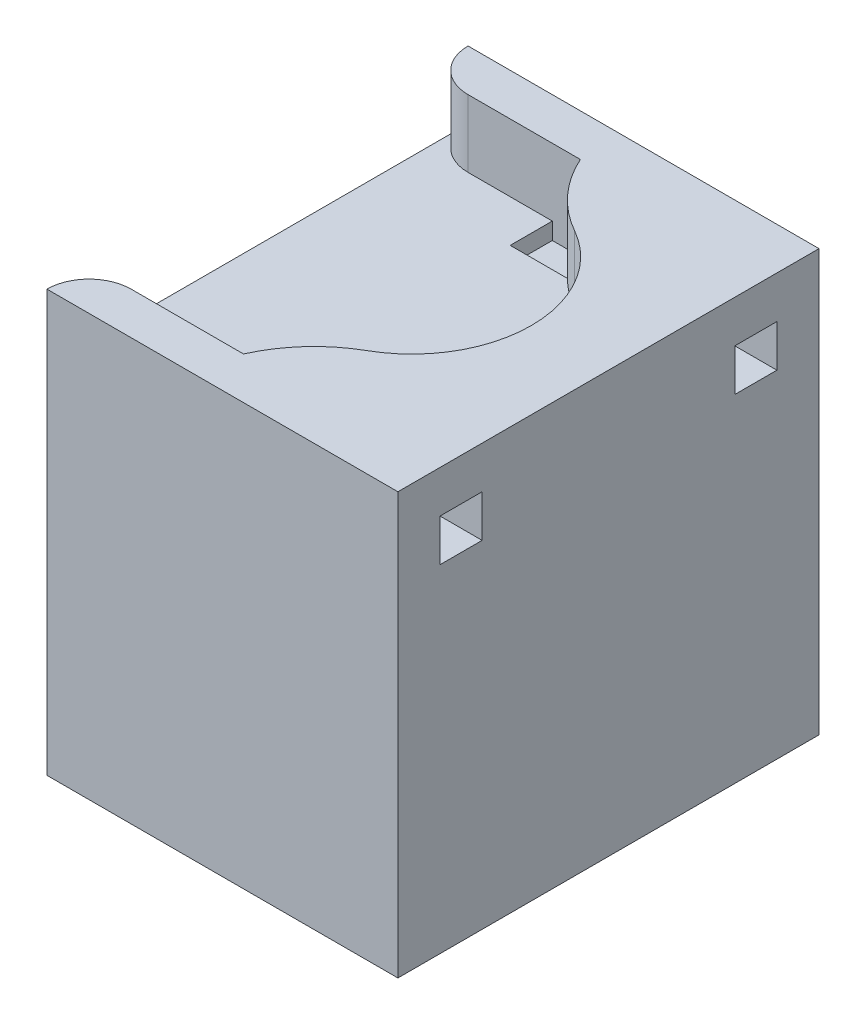
ISO-10303-21;
HEADER;
FILE_DESCRIPTION(('STEP AP214'),'2;1');
FILE_NAME('part.step','',(''),(''),'','','');
FILE_SCHEMA(('AUTOMOTIVE_DESIGN { 1 0 10303 214 1 1 1 1 }'));
ENDSEC;
DATA;
#1=APPLICATION_CONTEXT('core data for automotive mechanical design processes');
#2=APPLICATION_PROTOCOL_DEFINITION('international standard','automotive_design',2000,#1);
#3=PRODUCT_CONTEXT('',#1,'mechanical');
#4=PRODUCT('Part','Part','',(#3));
#5=PRODUCT_RELATED_PRODUCT_CATEGORY('part','',(#4));
#6=PRODUCT_DEFINITION_FORMATION('','',#4);
#7=PRODUCT_DEFINITION_CONTEXT('part definition',#1,'design');
#8=PRODUCT_DEFINITION('design','',#6,#7);
#9=PRODUCT_DEFINITION_SHAPE('','',#8);
#10=(LENGTH_UNIT() NAMED_UNIT(*) SI_UNIT(.MILLI.,.METRE.));
#11=(NAMED_UNIT(*) PLANE_ANGLE_UNIT() SI_UNIT($,.RADIAN.));
#12=(NAMED_UNIT(*) SI_UNIT($,.STERADIAN.) SOLID_ANGLE_UNIT());
#13=UNCERTAINTY_MEASURE_WITH_UNIT(LENGTH_MEASURE(1.E-05),#10,'distance_accuracy_value','');
#14=(GEOMETRIC_REPRESENTATION_CONTEXT(3) GLOBAL_UNCERTAINTY_ASSIGNED_CONTEXT((#13)) GLOBAL_UNIT_ASSIGNED_CONTEXT((#10,
#11,#12)) REPRESENTATION_CONTEXT('',''));
#15=CARTESIAN_POINT('',(0.,0.,0.));
#16=DIRECTION('',(0.,0.,1.));
#17=DIRECTION('',(1.,0.,0.));
#18=AXIS2_PLACEMENT_3D('',#15,#16,#17);
#19=CARTESIAN_POINT('',(12.5,30.,15.));
#20=DIRECTION('',(-1.,0.,0.));
#21=DIRECTION('',(0.,0.,1.));
#22=AXIS2_PLACEMENT_3D('',#19,#20,#21);
#23=PLANE('',#22);
#24=DIRECTION('',(0.,0.,-1.));
#25=VECTOR('',#24,1.);
#26=CARTESIAN_POINT('',(12.5,24.,-9.));
#27=LINE('',#26,#25);
#28=CARTESIAN_POINT('',(12.5,24.,-9.));
#29=VERTEX_POINT('',#28);
#30=CARTESIAN_POINT('',(12.5,24.,-12.));
#31=VERTEX_POINT('',#30);
#32=EDGE_CURVE('E235',#29,#31,#27,.T.);
#33=ORIENTED_EDGE('',*,*,#32,.F.);
#34=DIRECTION('',(0.,-1.,0.));
#35=VECTOR('',#34,1.);
#36=CARTESIAN_POINT('',(12.5,24.,-9.));
#37=LINE('',#36,#35);
#38=CARTESIAN_POINT('',(12.5,27.,-9.));
#39=VERTEX_POINT('',#38);
#40=EDGE_CURVE('E233',#39,#29,#37,.T.);
#41=ORIENTED_EDGE('',*,*,#40,.F.);
#42=DIRECTION('',(0.,0.,1.));
#43=VECTOR('',#42,1.);
#44=CARTESIAN_POINT('',(12.5,27.,-9.));
#45=LINE('',#44,#43);
#46=CARTESIAN_POINT('',(12.5,27.,-12.));
#47=VERTEX_POINT('',#46);
#48=EDGE_CURVE('E226',#47,#39,#45,.T.);
#49=ORIENTED_EDGE('',*,*,#48,.F.);
#50=DIRECTION('',(0.,1.,0.));
#51=VECTOR('',#50,1.);
#52=CARTESIAN_POINT('',(12.5,24.,-12.));
#53=LINE('',#52,#51);
#54=EDGE_CURVE('E239',#31,#47,#53,.T.);
#55=ORIENTED_EDGE('',*,*,#54,.F.);
#56=EDGE_LOOP('',(#33,#41,#49,#55));
#57=FACE_BOUND('',#56,.T.);
#58=DIRECTION('',(0.,1.,0.));
#59=VECTOR('',#58,1.);
#60=CARTESIAN_POINT('',(12.5,24.,9.));
#61=LINE('',#60,#59);
#62=CARTESIAN_POINT('',(12.5,24.,9.));
#63=VERTEX_POINT('',#62);
#64=CARTESIAN_POINT('',(12.5,27.,9.));
#65=VERTEX_POINT('',#64);
#66=EDGE_CURVE('E264',#63,#65,#61,.T.);
#67=ORIENTED_EDGE('',*,*,#66,.F.);
#68=DIRECTION('',(0.,0.,-1.));
#69=VECTOR('',#68,1.);
#70=CARTESIAN_POINT('',(12.5,24.,9.));
#71=LINE('',#70,#69);
#72=CARTESIAN_POINT('',(12.5,24.,12.));
#73=VERTEX_POINT('',#72);
#74=EDGE_CURVE('E222',#73,#63,#71,.T.);
#75=ORIENTED_EDGE('',*,*,#74,.F.);
#76=DIRECTION('',(0.,-1.,0.));
#77=VECTOR('',#76,1.);
#78=CARTESIAN_POINT('',(12.5,24.,12.));
#79=LINE('',#78,#77);
#80=CARTESIAN_POINT('',(12.5,27.,12.));
#81=VERTEX_POINT('',#80);
#82=EDGE_CURVE('E257',#81,#73,#79,.T.);
#83=ORIENTED_EDGE('',*,*,#82,.F.);
#84=DIRECTION('',(0.,0.,1.));
#85=VECTOR('',#84,1.);
#86=CARTESIAN_POINT('',(12.5,27.,9.));
#87=LINE('',#86,#85);
#88=EDGE_CURVE('E267',#65,#81,#87,.T.);
#89=ORIENTED_EDGE('',*,*,#88,.F.);
#90=EDGE_LOOP('',(#67,#75,#83,#89));
#91=FACE_BOUND('',#90,.T.);
#92=DIRECTION('',(0.,0.,-1.));
#93=VECTOR('',#92,1.);
#94=CARTESIAN_POINT('',(12.5,0.,15.));
#95=LINE('',#94,#93);
#96=CARTESIAN_POINT('',(12.5,0.,15.));
#97=VERTEX_POINT('',#96);
#98=CARTESIAN_POINT('',(12.5,0.,-15.));
#99=VERTEX_POINT('',#98);
#100=EDGE_CURVE('E246',#97,#99,#95,.T.);
#101=ORIENTED_EDGE('',*,*,#100,.T.);
#102=DIRECTION('',(0.,-1.,0.));
#103=VECTOR('',#102,1.);
#104=CARTESIAN_POINT('',(12.5,30.,-15.));
#105=LINE('',#104,#103);
#106=CARTESIAN_POINT('',(12.5,30.,-15.));
#107=VERTEX_POINT('',#106);
#108=EDGE_CURVE('E308',#107,#99,#105,.T.);
#109=ORIENTED_EDGE('',*,*,#108,.F.);
#110=DIRECTION('',(0.,0.,-1.));
#111=VECTOR('',#110,1.);
#112=CARTESIAN_POINT('',(12.5,30.,15.));
#113=LINE('',#112,#111);
#114=CARTESIAN_POINT('',(12.5,30.,15.));
#115=VERTEX_POINT('',#114);
#116=EDGE_CURVE('E279',#115,#107,#113,.T.);
#117=ORIENTED_EDGE('',*,*,#116,.F.);
#118=DIRECTION('',(0.,-1.,0.));
#119=VECTOR('',#118,1.);
#120=CARTESIAN_POINT('',(12.5,30.,15.));
#121=LINE('',#120,#119);
#122=EDGE_CURVE('E288',#115,#97,#121,.T.);
#123=ORIENTED_EDGE('',*,*,#122,.T.);
#124=EDGE_LOOP('',(#101,#109,#117,#123));
#125=FACE_BOUND('',#124,.T.);
#126=ADVANCED_FACE('F35',(#57,#91,#125),#23,.F.);
#127=CARTESIAN_POINT('',(-12.5,30.,-15.));
#128=DIRECTION('',(0.,0.,1.));
#129=DIRECTION('',(1.,0.,0.));
#130=AXIS2_PLACEMENT_3D('',#127,#128,#129);
#131=PLANE('',#130);
#132=DIRECTION('',(-1.,0.,0.));
#133=VECTOR('',#132,1.);
#134=CARTESIAN_POINT('',(-12.5,0.,-15.));
#135=LINE('',#134,#133);
#136=CARTESIAN_POINT('',(-12.5,0.,-15.));
#137=VERTEX_POINT('',#136);
#138=EDGE_CURVE('E291',#99,#137,#135,.T.);
#139=ORIENTED_EDGE('',*,*,#138,.T.);
#140=DIRECTION('',(0.,-1.,0.));
#141=VECTOR('',#140,1.);
#142=CARTESIAN_POINT('',(-12.5,30.,-15.));
#143=LINE('',#142,#141);
#144=CARTESIAN_POINT('',(-12.5,25.2,-15.));
#145=VERTEX_POINT('',#144);
#146=EDGE_CURVE('E304',#145,#137,#143,.T.);
#147=ORIENTED_EDGE('',*,*,#146,.F.);
#148=CARTESIAN_POINT('',(-12.5,30.,-15.));
#149=VERTEX_POINT('',#148);
#150=EDGE_CURVE('E305',#149,#145,#143,.T.);
#151=ORIENTED_EDGE('',*,*,#150,.F.);
#152=DIRECTION('',(-1.,0.,0.));
#153=VECTOR('',#152,1.);
#154=CARTESIAN_POINT('',(-12.5,30.,-15.));
#155=LINE('',#154,#153);
#156=EDGE_CURVE('E282',#107,#149,#155,.T.);
#157=ORIENTED_EDGE('',*,*,#156,.F.);
#158=ORIENTED_EDGE('',*,*,#108,.T.);
#159=EDGE_LOOP('',(#139,#147,#151,#157,#158));
#160=FACE_BOUND('',#159,.T.);
#161=ADVANCED_FACE('F358',(#160),#131,.F.);
#162=CARTESIAN_POINT('',(-12.5,30.,15.));
#163=DIRECTION('',(1.,0.,0.));
#164=DIRECTION('',(0.,0.,-1.));
#165=AXIS2_PLACEMENT_3D('',#162,#163,#164);
#166=PLANE('',#165);
#167=DIRECTION('',(0.,-1.,0.));
#168=VECTOR('',#167,1.);
#169=CARTESIAN_POINT('',(-12.5,30.,15.));
#170=LINE('',#169,#168);
#171=CARTESIAN_POINT('',(-12.5,25.2,15.));
#172=VERTEX_POINT('',#171);
#173=CARTESIAN_POINT('',(-12.5,0.,15.));
#174=VERTEX_POINT('',#173);
#175=EDGE_CURVE('E300',#172,#174,#170,.T.);
#176=ORIENTED_EDGE('',*,*,#175,.F.);
#177=DIRECTION('',(0.,0.,1.));
#178=VECTOR('',#177,1.);
#179=CARTESIAN_POINT('',(-12.5,25.2,12.));
#180=LINE('',#179,#178);
#181=EDGE_CURVE('E57',#145,#172,#180,.T.);
#182=ORIENTED_EDGE('',*,*,#181,.F.);
#183=ORIENTED_EDGE('',*,*,#146,.T.);
#184=DIRECTION('',(0.,0.,1.));
#185=VECTOR('',#184,1.);
#186=CARTESIAN_POINT('',(-12.5,0.,15.));
#187=LINE('',#186,#185);
#188=EDGE_CURVE('E294',#137,#174,#187,.T.);
#189=ORIENTED_EDGE('',*,*,#188,.T.);
#190=EDGE_LOOP('',(#176,#182,#183,#189));
#191=FACE_BOUND('',#190,.T.);
#192=ADVANCED_FACE('F427',(#191),#166,.F.);
#193=CARTESIAN_POINT('',(-12.5,30.,15.));
#194=DIRECTION('',(0.,0.,-1.));
#195=DIRECTION('',(-1.,0.,0.));
#196=AXIS2_PLACEMENT_3D('',#193,#194,#195);
#197=PLANE('',#196);
#198=DIRECTION('',(1.,0.,0.));
#199=VECTOR('',#198,1.);
#200=CARTESIAN_POINT('',(-12.5,0.,15.));
#201=LINE('',#200,#199);
#202=EDGE_CURVE('E283',#174,#97,#201,.T.);
#203=ORIENTED_EDGE('',*,*,#202,.T.);
#204=ORIENTED_EDGE('',*,*,#122,.F.);
#205=DIRECTION('',(1.,0.,0.));
#206=VECTOR('',#205,1.);
#207=CARTESIAN_POINT('',(-12.5,30.,15.));
#208=LINE('',#207,#206);
#209=CARTESIAN_POINT('',(-12.5,30.,15.));
#210=VERTEX_POINT('',#209);
#211=EDGE_CURVE('E286',#210,#115,#208,.T.);
#212=ORIENTED_EDGE('',*,*,#211,.F.);
#213=EDGE_CURVE('E301',#210,#172,#170,.T.);
#214=ORIENTED_EDGE('',*,*,#213,.T.);
#215=ORIENTED_EDGE('',*,*,#175,.T.);
#216=EDGE_LOOP('',(#203,#204,#212,#214,#215));
#217=FACE_BOUND('',#216,.T.);
#218=ADVANCED_FACE('F348',(#217),#197,.F.);
#219=CARTESIAN_POINT('',(0.,30.,0.));
#220=DIRECTION('',(0.,-1.,0.));
#221=DIRECTION('',(0.,0.,-1.));
#222=AXIS2_PLACEMENT_3D('',#219,#220,#221);
#223=PLANE('',#222);
#224=DIRECTION('',(1.,0.,0.));
#225=VECTOR('',#224,1.);
#226=CARTESIAN_POINT('',(-12.5,30.,12.));
#227=LINE('',#226,#225);
#228=CARTESIAN_POINT('',(-9.5,30.,12.));
#229=VERTEX_POINT('',#228);
#230=CARTESIAN_POINT('',(-1.5,30.,12.));
#231=VERTEX_POINT('',#230);
#232=EDGE_CURVE('E179',#229,#231,#227,.T.);
#233=ORIENTED_EDGE('',*,*,#232,.F.);
#234=CARTESIAN_POINT('',(-9.5,30.,15.));
#235=DIRECTION('',(0.,-1.,0.));
#236=DIRECTION('',(0.,0.,-1.));
#237=AXIS2_PLACEMENT_3D('',#234,#235,#236);
#238=CIRCLE('',#237,3.);
#239=EDGE_CURVE('E334',#229,#210,#238,.F.);
#240=ORIENTED_EDGE('',*,*,#239,.T.);
#241=ORIENTED_EDGE('',*,*,#211,.T.);
#242=ORIENTED_EDGE('',*,*,#116,.T.);
#243=ORIENTED_EDGE('',*,*,#156,.T.);
#244=CARTESIAN_POINT('',(-9.5,30.,-15.));
#245=DIRECTION('',(0.,-1.,0.));
#246=DIRECTION('',(0.,0.,-1.));
#247=AXIS2_PLACEMENT_3D('',#244,#245,#246);
#248=CIRCLE('',#247,3.);
#249=CARTESIAN_POINT('',(-9.5,30.,-12.));
#250=VERTEX_POINT('',#249);
#251=EDGE_CURVE('E332',#149,#250,#248,.F.);
#252=ORIENTED_EDGE('',*,*,#251,.T.);
#253=DIRECTION('',(-1.,0.,0.));
#254=VECTOR('',#253,1.);
#255=CARTESIAN_POINT('',(-12.5,30.,-12.));
#256=LINE('',#255,#254);
#257=CARTESIAN_POINT('',(-1.5,30.,-12.));
#258=VERTEX_POINT('',#257);
#259=EDGE_CURVE('E387',#258,#250,#256,.T.);
#260=ORIENTED_EDGE('',*,*,#259,.F.);
#261=CARTESIAN_POINT('',(7.62366214507639,30.,-16.09375));
#262=DIRECTION('',(0.,-1.,0.));
#263=DIRECTION('',(0.,0.,-1.));
#264=AXIS2_PLACEMENT_3D('',#261,#262,#263);
#265=CIRCLE('',#264,10.);
#266=CARTESIAN_POINT('',(2.69195287746753,30.,-7.39442567567568));
#267=VERTEX_POINT('',#266);
#268=EDGE_CURVE('E199',#258,#267,#265,.F.);
#269=ORIENTED_EDGE('',*,*,#268,.T.);
#270=CARTESIAN_POINT('',(-1.5,30.,0.));
#271=DIRECTION('',(0.,1.,0.));
#272=DIRECTION('',(0.,0.,-1.));
#273=AXIS2_PLACEMENT_3D('',#270,#271,#272);
#274=CIRCLE('',#273,8.5);
#275=CARTESIAN_POINT('',(2.69195287746753,30.,7.39442567567567));
#276=VERTEX_POINT('',#275);
#277=EDGE_CURVE('E189',#276,#267,#274,.T.);
#278=ORIENTED_EDGE('',*,*,#277,.F.);
#279=CARTESIAN_POINT('',(7.62366214507639,30.,16.09375));
#280=DIRECTION('',(0.,-1.,0.));
#281=DIRECTION('',(0.,0.,-1.));
#282=AXIS2_PLACEMENT_3D('',#279,#280,#281);
#283=CIRCLE('',#282,10.);
#284=EDGE_CURVE('E192',#276,#231,#283,.F.);
#285=ORIENTED_EDGE('',*,*,#284,.T.);
#286=EDGE_LOOP('',(#233,#240,#241,#242,#243,#252,#260,#269,#278,#285));
#287=FACE_BOUND('',#286,.T.);
#288=ADVANCED_FACE('F193',(#287),#223,.F.);
#289=CARTESIAN_POINT('',(0.,0.,0.));
#290=DIRECTION('',(0.,-1.,0.));
#291=DIRECTION('',(0.,0.,-1.));
#292=AXIS2_PLACEMENT_3D('',#289,#290,#291);
#293=PLANE('',#292);
#294=ORIENTED_EDGE('',*,*,#100,.F.);
#295=ORIENTED_EDGE('',*,*,#202,.F.);
#296=ORIENTED_EDGE('',*,*,#188,.F.);
#297=ORIENTED_EDGE('',*,*,#138,.F.);
#298=EDGE_LOOP('',(#294,#295,#296,#297));
#299=FACE_BOUND('',#298,.T.);
#300=ADVANCED_FACE('F487',(#299),#293,.T.);
#301=CARTESIAN_POINT('',(-3.5,24.,9.));
#302=DIRECTION('',(0.,-1.,0.));
#303=DIRECTION('',(0.,0.,-1.));
#304=AXIS2_PLACEMENT_3D('',#301,#302,#303);
#305=PLANE('',#304);
#306=ORIENTED_EDGE('',*,*,#74,.T.);
#307=DIRECTION('',(1.,0.,0.));
#308=VECTOR('',#307,1.);
#309=CARTESIAN_POINT('',(-3.5,24.,9.));
#310=LINE('',#309,#308);
#311=CARTESIAN_POINT('',(-3.5,24.,9.));
#312=VERTEX_POINT('',#311);
#313=EDGE_CURVE('E262',#312,#63,#310,.T.);
#314=ORIENTED_EDGE('',*,*,#313,.F.);
#315=DIRECTION('',(0.,0.,-1.));
#316=VECTOR('',#315,1.);
#317=CARTESIAN_POINT('',(-3.5,24.,9.));
#318=LINE('',#317,#316);
#319=CARTESIAN_POINT('',(-3.5,24.,12.));
#320=VERTEX_POINT('',#319);
#321=EDGE_CURVE('E253',#320,#312,#318,.T.);
#322=ORIENTED_EDGE('',*,*,#321,.F.);
#323=DIRECTION('',(1.,0.,0.));
#324=VECTOR('',#323,1.);
#325=CARTESIAN_POINT('',(-3.5,24.,12.));
#326=LINE('',#325,#324);
#327=EDGE_CURVE('E236',#320,#73,#326,.T.);
#328=ORIENTED_EDGE('',*,*,#327,.T.);
#329=EDGE_LOOP('',(#306,#314,#322,#328));
#330=FACE_BOUND('',#329,.T.);
#331=ADVANCED_FACE('F408',(#330),#305,.F.);
#332=CARTESIAN_POINT('',(-3.5,24.,12.));
#333=DIRECTION('',(0.,0.,1.));
#334=DIRECTION('',(1.,0.,0.));
#335=AXIS2_PLACEMENT_3D('',#332,#333,#334);
#336=PLANE('',#335);
#337=DIRECTION('',(1.,0.,0.));
#338=VECTOR('',#337,1.);
#339=CARTESIAN_POINT('',(-12.5,25.2,12.));
#340=LINE('',#339,#338);
#341=CARTESIAN_POINT('',(-9.5,25.2,12.));
#342=VERTEX_POINT('',#341);
#343=CARTESIAN_POINT('',(-3.5,25.2,12.));
#344=VERTEX_POINT('',#343);
#345=EDGE_CURVE('E338',#342,#344,#340,.T.);
#346=ORIENTED_EDGE('',*,*,#345,.F.);
#347=DIRECTION('',(0.,1.,0.));
#348=VECTOR('',#347,1.);
#349=CARTESIAN_POINT('',(-9.5,24.,12.));
#350=LINE('',#349,#348);
#351=EDGE_CURVE('E187',#342,#229,#350,.T.);
#352=ORIENTED_EDGE('',*,*,#351,.T.);
#353=ORIENTED_EDGE('',*,*,#232,.T.);
#354=DIRECTION('',(0.,1.,0.));
#355=VECTOR('',#354,1.);
#356=CARTESIAN_POINT('',(-1.5,25.2,12.));
#357=LINE('',#356,#355);
#358=CARTESIAN_POINT('',(-1.5,27.,12.));
#359=VERTEX_POINT('',#358);
#360=EDGE_CURVE('E184',#359,#231,#357,.T.);
#361=ORIENTED_EDGE('',*,*,#360,.F.);
#362=DIRECTION('',(1.,0.,0.));
#363=VECTOR('',#362,1.);
#364=CARTESIAN_POINT('',(-3.5,27.,12.));
#365=LINE('',#364,#363);
#366=EDGE_CURVE('E273',#359,#81,#365,.T.);
#367=ORIENTED_EDGE('',*,*,#366,.T.);
#368=ORIENTED_EDGE('',*,*,#82,.T.);
#369=ORIENTED_EDGE('',*,*,#327,.F.);
#370=DIRECTION('',(0.,-1.,0.));
#371=VECTOR('',#370,1.);
#372=CARTESIAN_POINT('',(-3.5,24.,12.));
#373=LINE('',#372,#371);
#374=EDGE_CURVE('E260',#344,#320,#373,.T.);
#375=ORIENTED_EDGE('',*,*,#374,.F.);
#376=EDGE_LOOP('',(#346,#352,#353,#361,#367,#368,#369,#375));
#377=FACE_BOUND('',#376,.T.);
#378=ADVANCED_FACE('F182',(#377),#336,.F.);
#379=CARTESIAN_POINT('',(-3.5,27.,9.));
#380=DIRECTION('',(0.,1.,0.));
#381=DIRECTION('',(0.,0.,1.));
#382=AXIS2_PLACEMENT_3D('',#379,#380,#381);
#383=PLANE('',#382);
#384=ORIENTED_EDGE('',*,*,#366,.F.);
#385=CARTESIAN_POINT('',(7.62366214507639,27.,16.09375));
#386=DIRECTION('',(0.,1.,0.));
#387=DIRECTION('',(0.,0.,1.));
#388=AXIS2_PLACEMENT_3D('',#385,#386,#387);
#389=CIRCLE('',#388,10.);
#390=CARTESIAN_POINT('',(0.575349514559786,27.,9.));
#391=VERTEX_POINT('',#390);
#392=EDGE_CURVE('E204',#359,#391,#389,.F.);
#393=ORIENTED_EDGE('',*,*,#392,.T.);
#394=DIRECTION('',(1.,0.,0.));
#395=VECTOR('',#394,1.);
#396=CARTESIAN_POINT('',(-3.5,27.,9.));
#397=LINE('',#396,#395);
#398=EDGE_CURVE('E275',#391,#65,#397,.T.);
#399=ORIENTED_EDGE('',*,*,#398,.T.);
#400=ORIENTED_EDGE('',*,*,#88,.T.);
#401=EDGE_LOOP('',(#384,#393,#399,#400));
#402=FACE_BOUND('',#401,.T.);
#403=ADVANCED_FACE('F403',(#402),#383,.F.);
#404=CARTESIAN_POINT('',(-3.5,24.,9.));
#405=DIRECTION('',(0.,0.,-1.));
#406=DIRECTION('',(-1.,0.,0.));
#407=AXIS2_PLACEMENT_3D('',#404,#405,#406);
#408=PLANE('',#407);
#409=DIRECTION('',(0.,1.,0.));
#410=VECTOR('',#409,1.);
#411=CARTESIAN_POINT('',(0.575349514559786,27.,9.));
#412=LINE('',#411,#410);
#413=CARTESIAN_POINT('',(0.575349514559786,25.2,9.));
#414=VERTEX_POINT('',#413);
#415=EDGE_CURVE('E198',#391,#414,#412,.F.);
#416=ORIENTED_EDGE('',*,*,#415,.T.);
#417=DIRECTION('',(-1.,0.,0.));
#418=VECTOR('',#417,1.);
#419=CARTESIAN_POINT('',(-3.5,25.2,9.));
#420=LINE('',#419,#418);
#421=CARTESIAN_POINT('',(-3.5,25.2,9.));
#422=VERTEX_POINT('',#421);
#423=EDGE_CURVE('E219',#414,#422,#420,.T.);
#424=ORIENTED_EDGE('',*,*,#423,.T.);
#425=DIRECTION('',(0.,1.,0.));
#426=VECTOR('',#425,1.);
#427=CARTESIAN_POINT('',(-3.5,24.,9.));
#428=LINE('',#427,#426);
#429=EDGE_CURVE('E256',#312,#422,#428,.T.);
#430=ORIENTED_EDGE('',*,*,#429,.F.);
#431=ORIENTED_EDGE('',*,*,#313,.T.);
#432=ORIENTED_EDGE('',*,*,#66,.T.);
#433=ORIENTED_EDGE('',*,*,#398,.F.);
#434=EDGE_LOOP('',(#416,#424,#430,#431,#432,#433));
#435=FACE_BOUND('',#434,.T.);
#436=ADVANCED_FACE('F398',(#435),#408,.F.);
#437=CARTESIAN_POINT('',(-3.5,0.,0.));
#438=DIRECTION('',(-1.,0.,0.));
#439=DIRECTION('',(0.,0.,1.));
#440=AXIS2_PLACEMENT_3D('',#437,#438,#439);
#441=PLANE('',#440);
#442=ORIENTED_EDGE('',*,*,#429,.T.);
#443=DIRECTION('',(0.,0.,1.));
#444=VECTOR('',#443,1.);
#445=CARTESIAN_POINT('',(-3.5,25.2,0.));
#446=LINE('',#445,#444);
#447=EDGE_CURVE('E216',#422,#344,#446,.T.);
#448=ORIENTED_EDGE('',*,*,#447,.T.);
#449=ORIENTED_EDGE('',*,*,#374,.T.);
#450=ORIENTED_EDGE('',*,*,#321,.T.);
#451=EDGE_LOOP('',(#442,#448,#449,#450));
#452=FACE_BOUND('',#451,.T.);
#453=ADVANCED_FACE('F410',(#452),#441,.F.);
#454=CARTESIAN_POINT('',(-3.5,24.,-9.));
#455=DIRECTION('',(0.,0.,1.));
#456=DIRECTION('',(1.,0.,0.));
#457=AXIS2_PLACEMENT_3D('',#454,#455,#456);
#458=PLANE('',#457);
#459=DIRECTION('',(1.,0.,0.));
#460=VECTOR('',#459,1.);
#461=CARTESIAN_POINT('',(-3.5,25.2,-9.));
#462=LINE('',#461,#460);
#463=CARTESIAN_POINT('',(-3.5,25.2,-9.));
#464=VERTEX_POINT('',#463);
#465=CARTESIAN_POINT('',(0.575349514559791,25.2,-9.));
#466=VERTEX_POINT('',#465);
#467=EDGE_CURVE('E209',#464,#466,#462,.T.);
#468=ORIENTED_EDGE('',*,*,#467,.T.);
#469=DIRECTION('',(0.,1.,0.));
#470=VECTOR('',#469,1.);
#471=CARTESIAN_POINT('',(0.575349514559791,25.2,-9.));
#472=LINE('',#471,#470);
#473=CARTESIAN_POINT('',(0.575349514559791,27.,-9.));
#474=VERTEX_POINT('',#473);
#475=EDGE_CURVE('E322',#466,#474,#472,.T.);
#476=ORIENTED_EDGE('',*,*,#475,.T.);
#477=DIRECTION('',(1.,0.,0.));
#478=VECTOR('',#477,1.);
#479=CARTESIAN_POINT('',(-3.5,27.,-9.));
#480=LINE('',#479,#478);
#481=EDGE_CURVE('E244',#474,#39,#480,.T.);
#482=ORIENTED_EDGE('',*,*,#481,.T.);
#483=ORIENTED_EDGE('',*,*,#40,.T.);
#484=DIRECTION('',(1.,0.,0.));
#485=VECTOR('',#484,1.);
#486=CARTESIAN_POINT('',(-3.5,24.,-9.));
#487=LINE('',#486,#485);
#488=CARTESIAN_POINT('',(-3.5,24.,-9.));
#489=VERTEX_POINT('',#488);
#490=EDGE_CURVE('E232',#489,#29,#487,.T.);
#491=ORIENTED_EDGE('',*,*,#490,.F.);
#492=DIRECTION('',(0.,-1.,0.));
#493=VECTOR('',#492,1.);
#494=CARTESIAN_POINT('',(-3.5,24.,-9.));
#495=LINE('',#494,#493);
#496=EDGE_CURVE('E223',#464,#489,#495,.T.);
#497=ORIENTED_EDGE('',*,*,#496,.F.);
#498=EDGE_LOOP('',(#468,#476,#482,#483,#491,#497));
#499=FACE_BOUND('',#498,.T.);
#500=ADVANCED_FACE('F412',(#499),#458,.F.);
#501=CARTESIAN_POINT('',(-3.5,27.,-9.));
#502=DIRECTION('',(0.,1.,0.));
#503=DIRECTION('',(0.,0.,1.));
#504=AXIS2_PLACEMENT_3D('',#501,#502,#503);
#505=PLANE('',#504);
#506=ORIENTED_EDGE('',*,*,#481,.F.);
#507=CARTESIAN_POINT('',(7.62366214507639,27.,-16.09375));
#508=DIRECTION('',(0.,1.,0.));
#509=DIRECTION('',(0.,0.,1.));
#510=AXIS2_PLACEMENT_3D('',#507,#508,#509);
#511=CIRCLE('',#510,10.);
#512=CARTESIAN_POINT('',(-1.5,27.,-12.));
#513=VERTEX_POINT('',#512);
#514=EDGE_CURVE('E324',#474,#513,#511,.F.);
#515=ORIENTED_EDGE('',*,*,#514,.T.);
#516=DIRECTION('',(1.,0.,0.));
#517=VECTOR('',#516,1.);
#518=CARTESIAN_POINT('',(-3.5,27.,-12.));
#519=LINE('',#518,#517);
#520=EDGE_CURVE('E247',#513,#47,#519,.T.);
#521=ORIENTED_EDGE('',*,*,#520,.T.);
#522=ORIENTED_EDGE('',*,*,#48,.T.);
#523=EDGE_LOOP('',(#506,#515,#521,#522));
#524=FACE_BOUND('',#523,.T.);
#525=ADVANCED_FACE('F380',(#524),#505,.F.);
#526=CARTESIAN_POINT('',(-3.5,24.,-12.));
#527=DIRECTION('',(0.,0.,-1.));
#528=DIRECTION('',(-1.,0.,0.));
#529=AXIS2_PLACEMENT_3D('',#526,#527,#528);
#530=PLANE('',#529);
#531=ORIENTED_EDGE('',*,*,#259,.T.);
#532=DIRECTION('',(0.,1.,0.));
#533=VECTOR('',#532,1.);
#534=CARTESIAN_POINT('',(-9.5,24.,-12.));
#535=LINE('',#534,#533);
#536=CARTESIAN_POINT('',(-9.5,25.2,-12.));
#537=VERTEX_POINT('',#536);
#538=EDGE_CURVE('E50',#250,#537,#535,.F.);
#539=ORIENTED_EDGE('',*,*,#538,.T.);
#540=DIRECTION('',(-1.,0.,0.));
#541=VECTOR('',#540,1.);
#542=CARTESIAN_POINT('',(-12.5,25.2,-12.));
#543=LINE('',#542,#541);
#544=CARTESIAN_POINT('',(-3.5,25.2,-12.));
#545=VERTEX_POINT('',#544);
#546=EDGE_CURVE('E206',#545,#537,#543,.T.);
#547=ORIENTED_EDGE('',*,*,#546,.F.);
#548=DIRECTION('',(0.,1.,0.));
#549=VECTOR('',#548,1.);
#550=CARTESIAN_POINT('',(-3.5,24.,-12.));
#551=LINE('',#550,#549);
#552=CARTESIAN_POINT('',(-3.5,24.,-12.));
#553=VERTEX_POINT('',#552);
#554=EDGE_CURVE('E229',#553,#545,#551,.T.);
#555=ORIENTED_EDGE('',*,*,#554,.F.);
#556=DIRECTION('',(1.,0.,0.));
#557=VECTOR('',#556,1.);
#558=CARTESIAN_POINT('',(-3.5,24.,-12.));
#559=LINE('',#558,#557);
#560=EDGE_CURVE('E249',#553,#31,#559,.T.);
#561=ORIENTED_EDGE('',*,*,#560,.T.);
#562=ORIENTED_EDGE('',*,*,#54,.T.);
#563=ORIENTED_EDGE('',*,*,#520,.F.);
#564=DIRECTION('',(0.,1.,0.));
#565=VECTOR('',#564,1.);
#566=CARTESIAN_POINT('',(-1.5,25.2,-12.));
#567=LINE('',#566,#565);
#568=EDGE_CURVE('E205',#513,#258,#567,.T.);
#569=ORIENTED_EDGE('',*,*,#568,.T.);
#570=EDGE_LOOP('',(#531,#539,#547,#555,#561,#562,#563,#569));
#571=FACE_BOUND('',#570,.T.);
#572=ADVANCED_FACE('F362',(#571),#530,.F.);
#573=CARTESIAN_POINT('',(-3.5,24.,-9.));
#574=DIRECTION('',(0.,-1.,0.));
#575=DIRECTION('',(0.,0.,-1.));
#576=AXIS2_PLACEMENT_3D('',#573,#574,#575);
#577=PLANE('',#576);
#578=ORIENTED_EDGE('',*,*,#32,.T.);
#579=ORIENTED_EDGE('',*,*,#560,.F.);
#580=DIRECTION('',(0.,0.,-1.));
#581=VECTOR('',#580,1.);
#582=CARTESIAN_POINT('',(-3.5,24.,-9.));
#583=LINE('',#582,#581);
#584=EDGE_CURVE('E225',#489,#553,#583,.T.);
#585=ORIENTED_EDGE('',*,*,#584,.F.);
#586=ORIENTED_EDGE('',*,*,#490,.T.);
#587=EDGE_LOOP('',(#578,#579,#585,#586));
#588=FACE_BOUND('',#587,.T.);
#589=ADVANCED_FACE('F369',(#588),#577,.F.);
#590=CARTESIAN_POINT('',(-3.5,0.,0.));
#591=DIRECTION('',(-1.,0.,0.));
#592=DIRECTION('',(0.,0.,1.));
#593=AXIS2_PLACEMENT_3D('',#590,#591,#592);
#594=PLANE('',#593);
#595=ORIENTED_EDGE('',*,*,#554,.T.);
#596=DIRECTION('',(0.,0.,1.));
#597=VECTOR('',#596,1.);
#598=CARTESIAN_POINT('',(-3.5,25.2,0.));
#599=LINE('',#598,#597);
#600=EDGE_CURVE('E311',#545,#464,#599,.T.);
#601=ORIENTED_EDGE('',*,*,#600,.T.);
#602=ORIENTED_EDGE('',*,*,#496,.T.);
#603=ORIENTED_EDGE('',*,*,#584,.T.);
#604=EDGE_LOOP('',(#595,#601,#602,#603));
#605=FACE_BOUND('',#604,.T.);
#606=ADVANCED_FACE('F364',(#605),#594,.F.);
#607=CARTESIAN_POINT('',(-1.5,25.2,0.));
#608=DIRECTION('',(0.,-1.,0.));
#609=DIRECTION('',(0.,0.,-1.));
#610=AXIS2_PLACEMENT_3D('',#607,#608,#609);
#611=PLANE('',#610);
#612=ORIENTED_EDGE('',*,*,#423,.F.);
#613=CARTESIAN_POINT('',(7.62366214507639,25.2,16.09375));
#614=DIRECTION('',(0.,-1.,0.));
#615=DIRECTION('',(0.,0.,-1.));
#616=AXIS2_PLACEMENT_3D('',#613,#614,#615);
#617=CIRCLE('',#616,10.);
#618=CARTESIAN_POINT('',(2.69195287746753,25.2,7.39442567567567));
#619=VERTEX_POINT('',#618);
#620=EDGE_CURVE('E326',#414,#619,#617,.T.);
#621=ORIENTED_EDGE('',*,*,#620,.T.);
#622=CARTESIAN_POINT('',(-1.5,25.2,0.));
#623=DIRECTION('',(0.,1.,0.));
#624=DIRECTION('',(0.,0.,-1.));
#625=AXIS2_PLACEMENT_3D('',#622,#623,#624);
#626=CIRCLE('',#625,8.5);
#627=CARTESIAN_POINT('',(2.69195287746753,25.2,-7.39442567567568));
#628=VERTEX_POINT('',#627);
#629=EDGE_CURVE('E211',#619,#628,#626,.T.);
#630=ORIENTED_EDGE('',*,*,#629,.T.);
#631=CARTESIAN_POINT('',(7.62366214507639,25.2,-16.09375));
#632=DIRECTION('',(0.,-1.,0.));
#633=DIRECTION('',(0.,0.,-1.));
#634=AXIS2_PLACEMENT_3D('',#631,#632,#633);
#635=CIRCLE('',#634,10.);
#636=EDGE_CURVE('E328',#628,#466,#635,.T.);
#637=ORIENTED_EDGE('',*,*,#636,.T.);
#638=ORIENTED_EDGE('',*,*,#467,.F.);
#639=ORIENTED_EDGE('',*,*,#600,.F.);
#640=ORIENTED_EDGE('',*,*,#546,.T.);
#641=CARTESIAN_POINT('',(-9.5,25.2,-15.));
#642=DIRECTION('',(0.,-1.,0.));
#643=DIRECTION('',(0.,0.,-1.));
#644=AXIS2_PLACEMENT_3D('',#641,#642,#643);
#645=CIRCLE('',#644,3.);
#646=EDGE_CURVE('E11',#537,#145,#645,.T.);
#647=ORIENTED_EDGE('',*,*,#646,.T.);
#648=ORIENTED_EDGE('',*,*,#181,.T.);
#649=CARTESIAN_POINT('',(-9.5,25.2,15.));
#650=DIRECTION('',(0.,-1.,0.));
#651=DIRECTION('',(0.,0.,-1.));
#652=AXIS2_PLACEMENT_3D('',#649,#650,#651);
#653=CIRCLE('',#652,3.);
#654=EDGE_CURVE('E43',#172,#342,#653,.T.);
#655=ORIENTED_EDGE('',*,*,#654,.T.);
#656=ORIENTED_EDGE('',*,*,#345,.T.);
#657=ORIENTED_EDGE('',*,*,#447,.F.);
#658=EDGE_LOOP('',(#612,#621,#630,#637,#638,#639,#640,#647,#648,#655,#656,#657));
#659=FACE_BOUND('',#658,.T.);
#660=ADVANCED_FACE('F337',(#659),#611,.F.);
#661=CARTESIAN_POINT('',(-1.5,25.2,0.));
#662=DIRECTION('',(0.,1.,0.));
#663=DIRECTION('',(0.,0.,1.));
#664=AXIS2_PLACEMENT_3D('',#661,#662,#663);
#665=CYLINDRICAL_SURFACE('',#664,8.5);
#666=ORIENTED_EDGE('',*,*,#629,.F.);
#667=DIRECTION('',(0.,1.,0.));
#668=VECTOR('',#667,1.);
#669=CARTESIAN_POINT('',(2.69195287746753,25.2,7.39442567567567));
#670=LINE('',#669,#668);
#671=EDGE_CURVE('E316',#619,#276,#670,.T.);
#672=ORIENTED_EDGE('',*,*,#671,.T.);
#673=ORIENTED_EDGE('',*,*,#277,.T.);
#674=DIRECTION('',(0.,1.,0.));
#675=VECTOR('',#674,1.);
#676=CARTESIAN_POINT('',(2.69195287746753,25.2,-7.39442567567568));
#677=LINE('',#676,#675);
#678=EDGE_CURVE('E314',#267,#628,#677,.F.);
#679=ORIENTED_EDGE('',*,*,#678,.T.);
#680=EDGE_LOOP('',(#666,#672,#673,#679));
#681=FACE_BOUND('',#680,.T.);
#682=ADVANCED_FACE('F395',(#681),#665,.F.);
#683=CARTESIAN_POINT('',(7.62366214507639,25.2,16.09375));
#684=DIRECTION('',(0.,1.,0.));
#685=DIRECTION('',(0.,0.,1.));
#686=AXIS2_PLACEMENT_3D('',#683,#684,#685);
#687=CYLINDRICAL_SURFACE('',#686,10.);
#688=ORIENTED_EDGE('',*,*,#392,.F.);
#689=ORIENTED_EDGE('',*,*,#360,.T.);
#690=ORIENTED_EDGE('',*,*,#284,.F.);
#691=ORIENTED_EDGE('',*,*,#671,.F.);
#692=ORIENTED_EDGE('',*,*,#620,.F.);
#693=ORIENTED_EDGE('',*,*,#415,.F.);
#694=EDGE_LOOP('',(#688,#689,#690,#691,#692,#693));
#695=FACE_BOUND('',#694,.T.);
#696=ADVANCED_FACE('F202',(#695),#687,.T.);
#697=CARTESIAN_POINT('',(7.62366214507639,25.2,-16.09375));
#698=DIRECTION('',(0.,1.,0.));
#699=DIRECTION('',(0.,0.,1.));
#700=AXIS2_PLACEMENT_3D('',#697,#698,#699);
#701=CYLINDRICAL_SURFACE('',#700,10.);
#702=ORIENTED_EDGE('',*,*,#636,.F.);
#703=ORIENTED_EDGE('',*,*,#678,.F.);
#704=ORIENTED_EDGE('',*,*,#268,.F.);
#705=ORIENTED_EDGE('',*,*,#568,.F.);
#706=ORIENTED_EDGE('',*,*,#514,.F.);
#707=ORIENTED_EDGE('',*,*,#475,.F.);
#708=EDGE_LOOP('',(#702,#703,#704,#705,#706,#707));
#709=FACE_BOUND('',#708,.T.);
#710=ADVANCED_FACE('F385',(#709),#701,.T.);
#711=CARTESIAN_POINT('',(-9.5,24.,15.));
#712=DIRECTION('',(0.,1.,0.));
#713=DIRECTION('',(0.,0.,1.));
#714=AXIS2_PLACEMENT_3D('',#711,#712,#713);
#715=CYLINDRICAL_SURFACE('',#714,3.);
#716=ORIENTED_EDGE('',*,*,#654,.F.);
#717=ORIENTED_EDGE('',*,*,#213,.F.);
#718=ORIENTED_EDGE('',*,*,#239,.F.);
#719=ORIENTED_EDGE('',*,*,#351,.F.);
#720=EDGE_LOOP('',(#716,#717,#718,#719));
#721=FACE_BOUND('',#720,.T.);
#722=ADVANCED_FACE('F344',(#721),#715,.T.);
#723=CARTESIAN_POINT('',(-9.5,30.,-15.));
#724=DIRECTION('',(0.,1.,0.));
#725=DIRECTION('',(0.,0.,1.));
#726=AXIS2_PLACEMENT_3D('',#723,#724,#725);
#727=CYLINDRICAL_SURFACE('',#726,3.);
#728=ORIENTED_EDGE('',*,*,#646,.F.);
#729=ORIENTED_EDGE('',*,*,#538,.F.);
#730=ORIENTED_EDGE('',*,*,#251,.F.);
#731=ORIENTED_EDGE('',*,*,#150,.T.);
#732=EDGE_LOOP('',(#728,#729,#730,#731));
#733=FACE_BOUND('',#732,.T.);
#734=ADVANCED_FACE('F37',(#733),#727,.T.);
#735=CLOSED_SHELL('',(#126,#161,#192,#218,#288,#300,#331,#378,#403,#436,#453,#500,#525,#572,
#589,#606,#660,#682,#696,#710,#722,#734));
#736=MANIFOLD_SOLID_BREP('B2',#735);
#737=ADVANCED_BREP_SHAPE_REPRESENTATION('',(#18,#736),#14);
#738=SHAPE_DEFINITION_REPRESENTATION(#9,#737);
ENDSEC;
END-ISO-10303-21;
